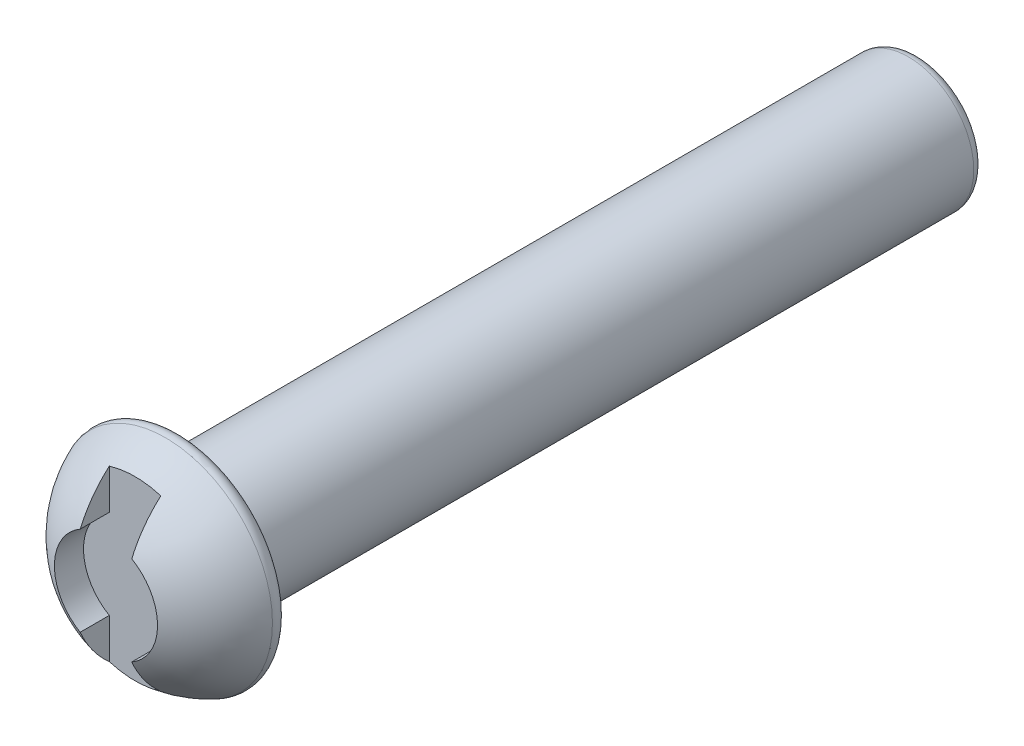
ISO-10303-21;
HEADER;
FILE_DESCRIPTION(('STEP AP214'),'2;1');
FILE_NAME('part.step','',(''),(''),'','','');
FILE_SCHEMA(('AUTOMOTIVE_DESIGN { 1 0 10303 214 1 1 1 1 }'));
ENDSEC;
DATA;
#1=APPLICATION_CONTEXT('core data for automotive mechanical design processes');
#2=APPLICATION_PROTOCOL_DEFINITION('international standard','automotive_design',2000,#1);
#3=PRODUCT_CONTEXT('',#1,'mechanical');
#4=PRODUCT('Part','Part','',(#3));
#5=PRODUCT_RELATED_PRODUCT_CATEGORY('part','',(#4));
#6=PRODUCT_DEFINITION_FORMATION('','',#4);
#7=PRODUCT_DEFINITION_CONTEXT('part definition',#1,'design');
#8=PRODUCT_DEFINITION('design','',#6,#7);
#9=PRODUCT_DEFINITION_SHAPE('','',#8);
#10=(LENGTH_UNIT() NAMED_UNIT(*) SI_UNIT(.MILLI.,.METRE.));
#11=(NAMED_UNIT(*) PLANE_ANGLE_UNIT() SI_UNIT($,.RADIAN.));
#12=(NAMED_UNIT(*) SI_UNIT($,.STERADIAN.) SOLID_ANGLE_UNIT());
#13=UNCERTAINTY_MEASURE_WITH_UNIT(LENGTH_MEASURE(1.E-05),#10,'distance_accuracy_value','');
#14=(GEOMETRIC_REPRESENTATION_CONTEXT(3) GLOBAL_UNCERTAINTY_ASSIGNED_CONTEXT((#13)) GLOBAL_UNIT_ASSIGNED_CONTEXT((#10,
#11,#12)) REPRESENTATION_CONTEXT('',''));
#15=CARTESIAN_POINT('',(0.,0.,0.));
#16=DIRECTION('',(0.,0.,1.));
#17=DIRECTION('',(1.,0.,0.));
#18=AXIS2_PLACEMENT_3D('',#15,#16,#17);
#19=CARTESIAN_POINT('',(0.,0.,-1.68125));
#20=DIRECTION('',(0.,0.,1.));
#21=DIRECTION('',(0.,1.,0.));
#22=AXIS2_PLACEMENT_3D('',#19,#20,#21);
#23=SPHERICAL_SURFACE('',#22,1.68125);
#24=CARTESIAN_POINT('',(0.,0.,-1.0430612244898));
#25=DIRECTION('',(0.,0.,-1.));
#26=DIRECTION('',(-1.,0.,0.));
#27=AXIS2_PLACEMENT_3D('',#24,#25,#26);
#28=CIRCLE('',#27,1.55541526587365);
#29=CARTESIAN_POINT('',(-1.55541526587365,0.,-1.0430612244898));
#30=VERTEX_POINT('',#29);
#31=EDGE_CURVE('E41',#30,#30,#28,.F.);
#32=ORIENTED_EDGE('',*,*,#31,.T.);
#33=EDGE_LOOP('',(#32));
#34=FACE_BOUND('',#33,.T.);
#35=CARTESIAN_POINT('',(-0.375,0.,-1.68125));
#36=DIRECTION('',(-1.,0.,0.));
#37=DIRECTION('',(0.,-1.,0.));
#38=AXIS2_PLACEMENT_3D('',#35,#36,#37);
#39=CIRCLE('',#38,1.63889492112826);
#40=CARTESIAN_POINT('',(-0.375,-1.23161479367536,-0.6));
#41=VERTEX_POINT('',#40);
#42=CARTESIAN_POINT('',(-0.375,-0.64951905283833,-0.176556821142596));
#43=VERTEX_POINT('',#42);
#44=EDGE_CURVE('E134',#41,#43,#39,.T.);
#45=ORIENTED_EDGE('',*,*,#44,.T.);
#46=CARTESIAN_POINT('',(0.,0.,-0.176556821142596));
#47=DIRECTION('',(0.,0.,-1.));
#48=DIRECTION('',(-1.,0.,0.));
#49=AXIS2_PLACEMENT_3D('',#46,#47,#48);
#50=CIRCLE('',#49,0.75);
#51=CARTESIAN_POINT('',(-0.375,0.649519052838329,-0.176556821142596));
#52=VERTEX_POINT('',#51);
#53=EDGE_CURVE('E56',#43,#52,#50,.T.);
#54=ORIENTED_EDGE('',*,*,#53,.T.);
#55=CARTESIAN_POINT('',(-0.375,0.,-1.68125));
#56=DIRECTION('',(-1.,0.,0.));
#57=DIRECTION('',(0.,-1.,0.));
#58=AXIS2_PLACEMENT_3D('',#55,#56,#57);
#59=CIRCLE('',#58,1.63889492112826);
#60=CARTESIAN_POINT('',(-0.375,1.23161479367536,-0.6));
#61=VERTEX_POINT('',#60);
#62=EDGE_CURVE('E137',#52,#61,#59,.T.);
#63=ORIENTED_EDGE('',*,*,#62,.T.);
#64=CARTESIAN_POINT('',(0.,0.,-0.6));
#65=DIRECTION('',(0.,0.,1.));
#66=DIRECTION('',(1.,0.,0.));
#67=AXIS2_PLACEMENT_3D('',#64,#65,#66);
#68=CIRCLE('',#67,1.28743931895837);
#69=CARTESIAN_POINT('',(0.375,1.23161479367536,-0.6));
#70=VERTEX_POINT('',#69);
#71=EDGE_CURVE('E127',#70,#61,#68,.T.);
#72=ORIENTED_EDGE('',*,*,#71,.F.);
#73=CARTESIAN_POINT('',(0.375,0.,-1.68125));
#74=DIRECTION('',(1.,0.,0.));
#75=DIRECTION('',(0.,1.,0.));
#76=AXIS2_PLACEMENT_3D('',#73,#74,#75);
#77=CIRCLE('',#76,1.63889492112826);
#78=CARTESIAN_POINT('',(0.375,0.649519052838329,-0.176556821142596));
#79=VERTEX_POINT('',#78);
#80=EDGE_CURVE('E131',#70,#79,#77,.T.);
#81=ORIENTED_EDGE('',*,*,#80,.T.);
#82=CARTESIAN_POINT('',(0.,0.,-0.176556821142596));
#83=DIRECTION('',(0.,0.,-1.));
#84=DIRECTION('',(-1.,0.,0.));
#85=AXIS2_PLACEMENT_3D('',#82,#83,#84);
#86=CIRCLE('',#85,0.75);
#87=CARTESIAN_POINT('',(0.375,-0.64951905283833,-0.176556821142596));
#88=VERTEX_POINT('',#87);
#89=EDGE_CURVE('E129',#79,#88,#86,.T.);
#90=ORIENTED_EDGE('',*,*,#89,.T.);
#91=CARTESIAN_POINT('',(0.375,0.,-1.68125));
#92=DIRECTION('',(1.,0.,0.));
#93=DIRECTION('',(0.,1.,0.));
#94=AXIS2_PLACEMENT_3D('',#91,#92,#93);
#95=CIRCLE('',#94,1.63889492112826);
#96=CARTESIAN_POINT('',(0.375,-1.23161479367536,-0.6));
#97=VERTEX_POINT('',#96);
#98=EDGE_CURVE('E101',#88,#97,#95,.T.);
#99=ORIENTED_EDGE('',*,*,#98,.T.);
#100=EDGE_CURVE('E94',#41,#97,#68,.T.);
#101=ORIENTED_EDGE('',*,*,#100,.F.);
#102=EDGE_LOOP('',(#45,#54,#63,#72,#81,#90,#99,#101));
#103=FACE_BOUND('',#102,.T.);
#104=ADVANCED_FACE('F33',(#34,#103),#23,.T.);
#105=CARTESIAN_POINT('',(0.,0.,-12.));
#106=DIRECTION('',(0.,0.,1.));
#107=DIRECTION('',(1.,0.,0.));
#108=AXIS2_PLACEMENT_3D('',#105,#106,#107);
#109=PLANE('',#108);
#110=CARTESIAN_POINT('',(0.,0.,-12.));
#111=DIRECTION('',(0.,0.,1.));
#112=DIRECTION('',(1.,0.,0.));
#113=AXIS2_PLACEMENT_3D('',#110,#111,#112);
#114=CIRCLE('',#113,0.799999999999999);
#115=CARTESIAN_POINT('',(0.799999999999999,0.,-12.));
#116=VERTEX_POINT('',#115);
#117=EDGE_CURVE('E144',#116,#116,#114,.F.);
#118=ORIENTED_EDGE('',*,*,#117,.T.);
#119=EDGE_LOOP('',(#118));
#120=FACE_BOUND('',#119,.T.);
#121=ADVANCED_FACE('F160',(#120),#109,.F.);
#122=CARTESIAN_POINT('',(0.,0.,0.));
#123=DIRECTION('',(0.,0.,1.));
#124=DIRECTION('',(1.,0.,0.));
#125=AXIS2_PLACEMENT_3D('',#122,#123,#124);
#126=CYLINDRICAL_SURFACE('',#125,0.949999999999999);
#127=CARTESIAN_POINT('',(0.,0.,-11.85));
#128=DIRECTION('',(0.,0.,1.));
#129=DIRECTION('',(1.,0.,0.));
#130=AXIS2_PLACEMENT_3D('',#127,#128,#129);
#131=CIRCLE('',#130,0.949999999999999);
#132=CARTESIAN_POINT('',(0.949999999999999,0.,-11.85));
#133=VERTEX_POINT('',#132);
#134=EDGE_CURVE('E141',#133,#133,#131,.T.);
#135=ORIENTED_EDGE('',*,*,#134,.T.);
#136=EDGE_LOOP('',(#135));
#137=FACE_BOUND('',#136,.T.);
#138=CARTESIAN_POINT('',(0.,0.,-1.25));
#139=DIRECTION('',(0.,0.,1.));
#140=DIRECTION('',(1.,0.,0.));
#141=AXIS2_PLACEMENT_3D('',#138,#139,#140);
#142=CIRCLE('',#141,0.949999999999999);
#143=CARTESIAN_POINT('',(0.949999999999999,0.,-1.25));
#144=VERTEX_POINT('',#143);
#145=EDGE_CURVE('E120',#144,#144,#142,.T.);
#146=ORIENTED_EDGE('',*,*,#145,.F.);
#147=EDGE_LOOP('',(#146));
#148=FACE_BOUND('',#147,.T.);
#149=ADVANCED_FACE('F165',(#137,#148),#126,.T.);
#150=CARTESIAN_POINT('',(0.,0.949999999999999,-1.25));
#151=DIRECTION('',(0.,0.,1.));
#152=DIRECTION('',(1.,0.,0.));
#153=AXIS2_PLACEMENT_3D('',#150,#151,#152);
#154=PLANE('',#153);
#155=CARTESIAN_POINT('',(0.,0.,-1.25));
#156=DIRECTION('',(0.,0.,1.));
#157=DIRECTION('',(1.,0.,0.));
#158=AXIS2_PLACEMENT_3D('',#155,#156,#157);
#159=CIRCLE('',#158,1.41664215665072);
#160=CARTESIAN_POINT('',(1.41664215665072,0.,-1.25));
#161=VERTEX_POINT('',#160);
#162=EDGE_CURVE('E11',#161,#161,#159,.F.);
#163=ORIENTED_EDGE('',*,*,#162,.T.);
#164=EDGE_LOOP('',(#163));
#165=FACE_BOUND('',#164,.T.);
#166=ORIENTED_EDGE('',*,*,#145,.T.);
#167=EDGE_LOOP('',(#166));
#168=FACE_BOUND('',#167,.T.);
#169=ADVANCED_FACE('F171',(#165,#168),#154,.F.);
#170=CARTESIAN_POINT('',(-0.375,-0.64951905283833,-0.6));
#171=DIRECTION('',(-1.,0.,0.));
#172=DIRECTION('',(0.,-1.,0.));
#173=AXIS2_PLACEMENT_3D('',#170,#171,#172);
#174=PLANE('',#173);
#175=DIRECTION('',(0.,-1.,0.));
#176=VECTOR('',#175,1.);
#177=CARTESIAN_POINT('',(-0.375,-0.64951905283833,-0.6));
#178=LINE('',#177,#176);
#179=CARTESIAN_POINT('',(-0.375,-0.64951905283833,-0.6));
#180=VERTEX_POINT('',#179);
#181=EDGE_CURVE('E48',#180,#41,#178,.T.);
#182=ORIENTED_EDGE('',*,*,#181,.F.);
#183=DIRECTION('',(0.,0.,1.));
#184=VECTOR('',#183,1.);
#185=CARTESIAN_POINT('',(-0.375,-0.64951905283833,-0.6));
#186=LINE('',#185,#184);
#187=EDGE_CURVE('E118',#180,#43,#186,.T.);
#188=ORIENTED_EDGE('',*,*,#187,.T.);
#189=ORIENTED_EDGE('',*,*,#44,.F.);
#190=EDGE_LOOP('',(#182,#188,#189));
#191=FACE_BOUND('',#190,.T.);
#192=ADVANCED_FACE('F175',(#191),#174,.F.);
#193=CARTESIAN_POINT('',(0.,0.,-0.6));
#194=DIRECTION('',(0.,0.,1.));
#195=DIRECTION('',(1.,0.,0.));
#196=AXIS2_PLACEMENT_3D('',#193,#194,#195);
#197=CYLINDRICAL_SURFACE('',#196,0.75);
#198=ORIENTED_EDGE('',*,*,#187,.F.);
#199=CARTESIAN_POINT('',(0.,0.,-0.6));
#200=DIRECTION('',(0.,0.,1.));
#201=DIRECTION('',(1.,0.,0.));
#202=AXIS2_PLACEMENT_3D('',#199,#200,#201);
#203=CIRCLE('',#202,0.75);
#204=CARTESIAN_POINT('',(-0.375,0.649519052838329,-0.6));
#205=VERTEX_POINT('',#204);
#206=EDGE_CURVE('E115',#205,#180,#203,.T.);
#207=ORIENTED_EDGE('',*,*,#206,.F.);
#208=DIRECTION('',(0.,0.,1.));
#209=VECTOR('',#208,1.);
#210=CARTESIAN_POINT('',(-0.375,0.649519052838329,-0.6));
#211=LINE('',#210,#209);
#212=EDGE_CURVE('E121',#205,#52,#211,.T.);
#213=ORIENTED_EDGE('',*,*,#212,.T.);
#214=ORIENTED_EDGE('',*,*,#53,.F.);
#215=EDGE_LOOP('',(#198,#207,#213,#214));
#216=FACE_BOUND('',#215,.T.);
#217=ADVANCED_FACE('F188',(#216),#197,.F.);
#218=CARTESIAN_POINT('',(-0.375,1.91030489302506,-0.6));
#219=DIRECTION('',(-1.,0.,0.));
#220=DIRECTION('',(0.,-1.,0.));
#221=AXIS2_PLACEMENT_3D('',#218,#219,#220);
#222=PLANE('',#221);
#223=ORIENTED_EDGE('',*,*,#212,.F.);
#224=DIRECTION('',(0.,-1.,0.));
#225=VECTOR('',#224,1.);
#226=CARTESIAN_POINT('',(-0.375,1.91030489302506,-0.6));
#227=LINE('',#226,#225);
#228=EDGE_CURVE('E111',#61,#205,#227,.T.);
#229=ORIENTED_EDGE('',*,*,#228,.F.);
#230=ORIENTED_EDGE('',*,*,#62,.F.);
#231=EDGE_LOOP('',(#223,#229,#230));
#232=FACE_BOUND('',#231,.T.);
#233=ADVANCED_FACE('F184',(#232),#222,.F.);
#234=CARTESIAN_POINT('',(0.375,1.91030489302506,-0.6));
#235=DIRECTION('',(1.,0.,0.));
#236=DIRECTION('',(0.,1.,0.));
#237=AXIS2_PLACEMENT_3D('',#234,#235,#236);
#238=PLANE('',#237);
#239=DIRECTION('',(0.,1.,0.));
#240=VECTOR('',#239,1.);
#241=CARTESIAN_POINT('',(0.375,1.91030489302506,-0.6));
#242=LINE('',#241,#240);
#243=CARTESIAN_POINT('',(0.375,0.649519052838329,-0.6));
#244=VERTEX_POINT('',#243);
#245=EDGE_CURVE('E109',#244,#70,#242,.T.);
#246=ORIENTED_EDGE('',*,*,#245,.F.);
#247=DIRECTION('',(0.,0.,1.));
#248=VECTOR('',#247,1.);
#249=CARTESIAN_POINT('',(0.375,0.649519052838329,-0.6));
#250=LINE('',#249,#248);
#251=EDGE_CURVE('E104',#244,#79,#250,.T.);
#252=ORIENTED_EDGE('',*,*,#251,.T.);
#253=ORIENTED_EDGE('',*,*,#80,.F.);
#254=EDGE_LOOP('',(#246,#252,#253));
#255=FACE_BOUND('',#254,.T.);
#256=ADVANCED_FACE('F181',(#255),#238,.F.);
#257=CARTESIAN_POINT('',(0.,0.,-0.6));
#258=DIRECTION('',(0.,0.,1.));
#259=DIRECTION('',(1.,0.,0.));
#260=AXIS2_PLACEMENT_3D('',#257,#258,#259);
#261=CYLINDRICAL_SURFACE('',#260,0.75);
#262=ORIENTED_EDGE('',*,*,#251,.F.);
#263=CARTESIAN_POINT('',(0.,0.,-0.6));
#264=DIRECTION('',(0.,0.,1.));
#265=DIRECTION('',(1.,0.,0.));
#266=AXIS2_PLACEMENT_3D('',#263,#264,#265);
#267=CIRCLE('',#266,0.75);
#268=CARTESIAN_POINT('',(0.375,-0.64951905283833,-0.6));
#269=VERTEX_POINT('',#268);
#270=EDGE_CURVE('E92',#269,#244,#267,.T.);
#271=ORIENTED_EDGE('',*,*,#270,.F.);
#272=DIRECTION('',(0.,0.,1.));
#273=VECTOR('',#272,1.);
#274=CARTESIAN_POINT('',(0.375,-0.64951905283833,-0.6));
#275=LINE('',#274,#273);
#276=EDGE_CURVE('E99',#269,#88,#275,.T.);
#277=ORIENTED_EDGE('',*,*,#276,.T.);
#278=ORIENTED_EDGE('',*,*,#89,.F.);
#279=EDGE_LOOP('',(#262,#271,#277,#278));
#280=FACE_BOUND('',#279,.T.);
#281=ADVANCED_FACE('F106',(#280),#261,.F.);
#282=CARTESIAN_POINT('',(0.375,-0.64951905283833,-0.6));
#283=DIRECTION('',(1.,0.,0.));
#284=DIRECTION('',(0.,1.,0.));
#285=AXIS2_PLACEMENT_3D('',#282,#283,#284);
#286=PLANE('',#285);
#287=ORIENTED_EDGE('',*,*,#276,.F.);
#288=DIRECTION('',(0.,1.,0.));
#289=VECTOR('',#288,1.);
#290=CARTESIAN_POINT('',(0.375,-0.64951905283833,-0.6));
#291=LINE('',#290,#289);
#292=EDGE_CURVE('E87',#97,#269,#291,.T.);
#293=ORIENTED_EDGE('',*,*,#292,.F.);
#294=ORIENTED_EDGE('',*,*,#98,.F.);
#295=EDGE_LOOP('',(#287,#293,#294));
#296=FACE_BOUND('',#295,.T.);
#297=ADVANCED_FACE('F100',(#296),#286,.F.);
#298=CARTESIAN_POINT('',(0.,0.,-0.6));
#299=DIRECTION('',(0.,0.,1.));
#300=DIRECTION('',(1.,0.,0.));
#301=AXIS2_PLACEMENT_3D('',#298,#299,#300);
#302=PLANE('',#301);
#303=ORIENTED_EDGE('',*,*,#71,.T.);
#304=ORIENTED_EDGE('',*,*,#228,.T.);
#305=ORIENTED_EDGE('',*,*,#206,.T.);
#306=ORIENTED_EDGE('',*,*,#181,.T.);
#307=ORIENTED_EDGE('',*,*,#100,.T.);
#308=ORIENTED_EDGE('',*,*,#292,.T.);
#309=ORIENTED_EDGE('',*,*,#270,.T.);
#310=ORIENTED_EDGE('',*,*,#245,.T.);
#311=EDGE_LOOP('',(#303,#304,#305,#306,#307,#308,#309,#310));
#312=FACE_BOUND('',#311,.T.);
#313=ADVANCED_FACE('F89',(#312),#302,.T.);
#314=CARTESIAN_POINT('',(0.,0.,-11.85));
#315=DIRECTION('',(0.,0.,1.));
#316=DIRECTION('',(1.,0.,0.));
#317=AXIS2_PLACEMENT_3D('',#314,#315,#316);
#318=TOROIDAL_SURFACE('',#317,0.799999999999999,0.15);
#319=ORIENTED_EDGE('',*,*,#117,.F.);
#320=EDGE_LOOP('',(#319));
#321=FACE_BOUND('',#320,.T.);
#322=ORIENTED_EDGE('',*,*,#134,.F.);
#323=EDGE_LOOP('',(#322));
#324=FACE_BOUND('',#323,.T.);
#325=ADVANCED_FACE('F152',(#321,#324),#318,.T.);
#326=CARTESIAN_POINT('',(0.,0.,-1.1));
#327=DIRECTION('',(0.,0.,1.));
#328=DIRECTION('',(1.,0.,0.));
#329=AXIS2_PLACEMENT_3D('',#326,#327,#328);
#330=TOROIDAL_SURFACE('',#329,1.41664215665072,0.15);
#331=ORIENTED_EDGE('',*,*,#162,.F.);
#332=EDGE_LOOP('',(#331));
#333=FACE_BOUND('',#332,.T.);
#334=ORIENTED_EDGE('',*,*,#31,.F.);
#335=EDGE_LOOP('',(#334));
#336=FACE_BOUND('',#335,.T.);
#337=ADVANCED_FACE('F35',(#333,#336),#330,.T.);
#338=CLOSED_SHELL('',(#104,#121,#149,#169,#192,#217,#233,#256,#281,#297,#313,#325,#337));
#339=MANIFOLD_SOLID_BREP('B2',#338);
#340=ADVANCED_BREP_SHAPE_REPRESENTATION('',(#18,#339),#14);
#341=SHAPE_DEFINITION_REPRESENTATION(#9,#340);
ENDSEC;
END-ISO-10303-21;
